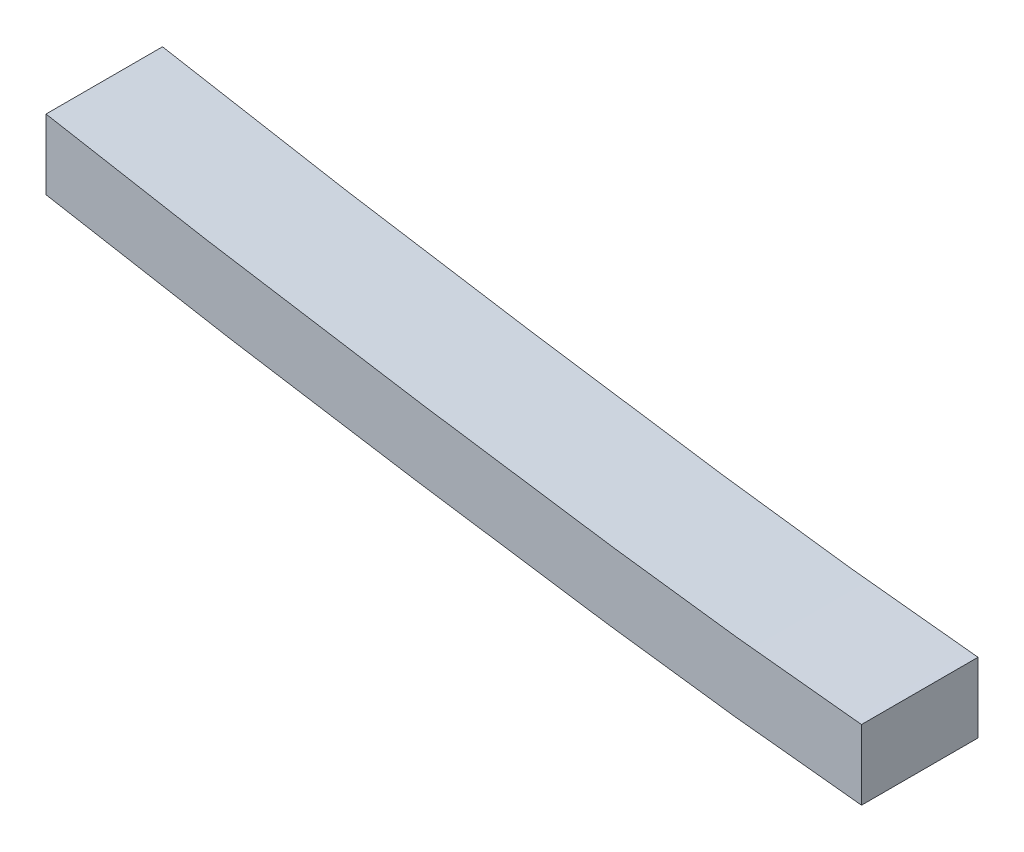
ISO-10303-21;
HEADER;
FILE_DESCRIPTION(('STEP AP214'),'2;1');
FILE_NAME('part.step','',(''),(''),'','','');
FILE_SCHEMA(('AUTOMOTIVE_DESIGN { 1 0 10303 214 1 1 1 1 }'));
ENDSEC;
DATA;
#1=APPLICATION_CONTEXT('core data for automotive mechanical design processes');
#2=APPLICATION_PROTOCOL_DEFINITION('international standard','automotive_design',2000,#1);
#3=PRODUCT_CONTEXT('',#1,'mechanical');
#4=PRODUCT('Part','Part','',(#3));
#5=PRODUCT_RELATED_PRODUCT_CATEGORY('part','',(#4));
#6=PRODUCT_DEFINITION_FORMATION('','',#4);
#7=PRODUCT_DEFINITION_CONTEXT('part definition',#1,'design');
#8=PRODUCT_DEFINITION('design','',#6,#7);
#9=PRODUCT_DEFINITION_SHAPE('','',#8);
#10=(LENGTH_UNIT() NAMED_UNIT(*) SI_UNIT(.MILLI.,.METRE.));
#11=(NAMED_UNIT(*) PLANE_ANGLE_UNIT() SI_UNIT($,.RADIAN.));
#12=(NAMED_UNIT(*) SI_UNIT($,.STERADIAN.) SOLID_ANGLE_UNIT());
#13=UNCERTAINTY_MEASURE_WITH_UNIT(LENGTH_MEASURE(1.E-05),#10,'distance_accuracy_value','');
#14=(GEOMETRIC_REPRESENTATION_CONTEXT(3) GLOBAL_UNCERTAINTY_ASSIGNED_CONTEXT((#13)) GLOBAL_UNIT_ASSIGNED_CONTEXT((#10,
#11,#12)) REPRESENTATION_CONTEXT('',''));
#15=CARTESIAN_POINT('',(0.,0.,0.));
#16=DIRECTION('',(0.,0.,1.));
#17=DIRECTION('',(1.,0.,0.));
#18=AXIS2_PLACEMENT_3D('',#15,#16,#17);
#19=CARTESIAN_POINT('',(-12.2190252308509,6.60300425842576,5.55));
#20=DIRECTION('',(0.,0.,1.));
#21=DIRECTION('',(1.,0.,0.));
#22=AXIS2_PLACEMENT_3D('',#19,#20,#21);
#23=PLANE('',#22);
#24=CARTESIAN_POINT('',(-8.71902523085093,6.08389376730887,5.55));
#25=CARTESIAN_POINT('',(-8.90481932831119,6.10063782187626,5.55));
#26=CARTESIAN_POINT('',(-9.08974031602656,6.12058943976316,5.55));
#27=CARTESIAN_POINT('',(-9.27376246282761,6.14272153894149,5.55));
#28=CARTESIAN_POINT('',(-9.40082328253992,6.15800297496665,5.55));
#29=CARTESIAN_POINT('',(-9.52745530195692,6.17432138143792,5.55));
#30=CARTESIAN_POINT('',(-9.65364799660021,6.19135877188536,5.55));
#31=CARTESIAN_POINT('',(-9.76704585129001,6.20666871935667,5.55));
#32=CARTESIAN_POINT('',(-9.88008886900471,6.22255849886021,5.55));
#33=CARTESIAN_POINT('',(-9.99276940780868,6.23883276318505,5.55));
#34=CARTESIAN_POINT('',(-10.0974990561943,6.25395869352375,5.55));
#35=CARTESIAN_POINT('',(-10.2019154980729,6.26941625717988,5.55));
#36=CARTESIAN_POINT('',(-10.3060135956174,6.28508908807513,5.55));
#37=CARTESIAN_POINT('',(-10.4059757492127,6.3001392183482,5.55));
#38=CARTESIAN_POINT('',(-10.5056442831997,6.31538734302663,5.55));
#39=CARTESIAN_POINT('',(-10.6050166861198,6.33077664184098,5.55));
#40=CARTESIAN_POINT('',(-10.7067309464635,6.34652861220814,5.55));
#41=CARTESIAN_POINT('',(-10.8081349646909,6.36242847683451,5.55));
#42=CARTESIAN_POINT('',(-10.9092289462605,6.37847177829881,5.55));
#43=CARTESIAN_POINT('',(-11.0198436378866,6.39602598693303,5.55));
#44=CARTESIAN_POINT('',(-11.130087207191,6.41375193667909,5.55));
#45=CARTESIAN_POINT('',(-11.239962684928,6.43171006483608,5.55));
#46=CARTESIAN_POINT('',(-11.3578105532593,6.45097120632197,5.55));
#47=CARTESIAN_POINT('',(-11.475235071375,6.47050018969724,5.55));
#48=CARTESIAN_POINT('',(-11.5922416684129,6.49043854821762,5.55));
#49=CARTESIAN_POINT('',(-11.727918541864,6.51355839115191,5.55));
#50=CARTESIAN_POINT('',(-11.8630336677974,6.53722987262494,5.55));
#51=CARTESIAN_POINT('',(-11.9975954228639,6.56174650106607,5.55));
#52=CARTESIAN_POINT('',(-12.071572258484,6.57522479280843,5.55));
#53=CARTESIAN_POINT('',(-12.1453818205482,6.58895961856022,5.55));
#54=CARTESIAN_POINT('',(-12.2190252308509,6.60300425842576,5.55));
#55=(BOUNDED_CURVE() B_SPLINE_CURVE(3,(#24,#25,#26,#27,#28,#29,#30,#31,#32,#33,#34,#35,#36,#37,
#38,#39,#40,#41,#42,#43,#44,#45,#46,#47,#48,#49,#50,#51,#52,#53,#54),.UNSPECIFIED.,.F.,
.F.) B_SPLINE_CURVE_WITH_KNOTS((4,3,3,3,3,3,3,3,3,3,4),(-0.19498564125759,-0.170688809271797,
-0.153912701383735,-0.138837544696349,-0.124826111346929,-0.111371369275719,-0.0975995463382309,
-0.082530736863067,-0.0663685584451572,-0.0476274456240645,-0.0373243084375754),
.UNSPECIFIED.) CURVE() GEOMETRIC_REPRESENTATION_ITEM() RATIONAL_B_SPLINE_CURVE((1.,1.,1.,1.,1.,
1.,1.,1.,1.,1.,1.,1.,1.,1.,1.,1.,1.,1.,1.,1.,1.,1.,1.,1.,1.,1.,1.,1.,1.,1.,1.)) REPRESENTATION_ITEM(''));
#56=CARTESIAN_POINT('',(-8.71902523085093,6.08389376730887,5.55));
#57=VERTEX_POINT('',#56);
#58=CARTESIAN_POINT('',(-12.2190252308509,6.60300425842576,5.55));
#59=VERTEX_POINT('',#58);
#60=EDGE_CURVE('E45',#57,#59,#55,.T.);
#61=ORIENTED_EDGE('',*,*,#60,.F.);
#62=DIRECTION('',(0.,1.,0.));
#63=VECTOR('',#62,1.);
#64=CARTESIAN_POINT('',(-8.71902523085093,6.08389376730887,5.55));
#65=LINE('',#64,#63);
#66=CARTESIAN_POINT('',(-8.71902523085093,6.38389376730887,5.55));
#67=VERTEX_POINT('',#66);
#68=EDGE_CURVE('E11',#57,#67,#65,.T.);
#69=ORIENTED_EDGE('',*,*,#68,.T.);
#70=CARTESIAN_POINT('',(-12.2190252308509,6.90300425842576,5.55));
#71=CARTESIAN_POINT('',(-12.0781613608036,6.87613990876096,5.55));
#72=CARTESIAN_POINT('',(-11.9366897589315,6.85040721379511,5.55));
#73=CARTESIAN_POINT('',(-11.7946018828376,6.82544044851815,5.55));
#74=CARTESIAN_POINT('',(-11.6702749912554,6.80359452890081,5.55));
#75=CARTESIAN_POINT('',(-11.5454761218485,6.78233315353963,5.55));
#76=CARTESIAN_POINT('',(-11.4201984231378,6.76145129679141,5.55));
#77=CARTESIAN_POINT('',(-11.310580436766,6.74317967213671,5.55));
#78=CARTESIAN_POINT('',(-11.2005957607161,6.72519821845924,5.55));
#79=CARTESIAN_POINT('',(-11.090240444414,6.70741508859998,5.55));
#80=CARTESIAN_POINT('',(-10.9896685970085,6.69120850895772,5.55));
#81=CARTESIAN_POINT('',(-10.8887888595256,6.6751665351971,5.55));
#82=CARTESIAN_POINT('',(-10.787599678124,6.65926336861859,5.55));
#83=CARTESIAN_POINT('',(-10.6884567770395,6.64368180101243,5.55));
#84=CARTESIAN_POINT('',(-10.5890167617251,6.62823300665637,5.55));
#85=CARTESIAN_POINT('',(-10.4892804607235,6.61294154485733,5.55));
#86=CARTESIAN_POINT('',(-10.385435307837,6.59702011833127,5.55));
#87=CARTESIAN_POINT('',(-10.2812689881523,6.58126940243937,5.55));
#88=CARTESIAN_POINT('',(-10.1767854383519,6.56577642157641,5.55));
#89=CARTESIAN_POINT('',(-10.064867756061,6.54918109615655,5.55));
#90=CARTESIAN_POINT('',(-9.95258619282989,6.53288203715611,5.55));
#91=CARTESIAN_POINT('',(-9.83994781387073,6.51704658656788,5.55));
#92=CARTESIAN_POINT('',(-9.7093978337298,6.498693004255,5.55));
#93=CARTESIAN_POINT('',(-9.57836864581011,6.48096259325002,5.55));
#94=CARTESIAN_POINT('',(-9.44687224716815,6.46418757602226,5.55));
#95=CARTESIAN_POINT('',(-9.24863448248732,6.43889835173888,5.55));
#96=CARTESIAN_POINT('',(-9.04933572094374,6.41578341672397,5.55));
#97=CARTESIAN_POINT('',(-8.84901155944429,6.3961324555279,5.55));
#98=CARTESIAN_POINT('',(-8.8057306012979,6.39188677481372,5.55));
#99=CARTESIAN_POINT('',(-8.76240173312139,6.3878029255162,5.55));
#100=CARTESIAN_POINT('',(-8.71902523085093,6.38389376730887,5.55));
#101=(BOUNDED_CURVE() B_SPLINE_CURVE(3,(#70,#71,#72,#73,#74,#75,#76,#77,#78,#79,#80,#81,#82,#83,
#84,#85,#86,#87,#88,#89,#90,#91,#92,#93,#94,#95,#96,#97,#98,#99,#100),.UNSPECIFIED.,.F.,
.F.) B_SPLINE_CURVE_WITH_KNOTS((4,3,3,3,3,3,3,3,3,3,4),(0.0373243084375755,0.0570319750400773,
0.0742761833172664,0.0893648655598069,0.103115871844744,0.116588800838088,0.130616776179978,
0.145642859142282,0.163058369294786,0.189313170483743,0.19498564125759),
.UNSPECIFIED.) CURVE() GEOMETRIC_REPRESENTATION_ITEM() RATIONAL_B_SPLINE_CURVE((1.,1.,1.,1.,1.,
1.,1.,1.,1.,1.,1.,1.,1.,1.,1.,1.,1.,1.,1.,1.,1.,1.,1.,1.,1.,1.,1.,1.,1.,1.,1.)) REPRESENTATION_ITEM(''));
#102=CARTESIAN_POINT('',(-12.2190252308509,6.90300425842576,5.55));
#103=VERTEX_POINT('',#102);
#104=EDGE_CURVE('E23',#103,#67,#101,.T.);
#105=ORIENTED_EDGE('',*,*,#104,.F.);
#106=DIRECTION('',(0.,1.,0.));
#107=VECTOR('',#106,1.);
#108=CARTESIAN_POINT('',(-12.2190252308509,6.60300425842576,5.55));
#109=LINE('',#108,#107);
#110=EDGE_CURVE('E32',#59,#103,#109,.T.);
#111=ORIENTED_EDGE('',*,*,#110,.F.);
#112=EDGE_LOOP('',(#61,#69,#105,#111));
#113=FACE_BOUND('',#112,.T.);
#114=ADVANCED_FACE('F17',(#113),#23,.T.);
#115=CARTESIAN_POINT('',(-12.2190252308509,6.60300425842576,5.05));
#116=DIRECTION('',(-1.,0.,0.));
#117=DIRECTION('',(0.,0.,1.));
#118=AXIS2_PLACEMENT_3D('',#115,#116,#117);
#119=PLANE('',#118);
#120=CARTESIAN_POINT('',(-12.2190252308509,6.60300425842576,5.55));
#121=CARTESIAN_POINT('',(-12.2190252308509,6.60300425842576,5.38333333333333));
#122=CARTESIAN_POINT('',(-12.2190252308509,6.60300425842576,5.21666666666667));
#123=CARTESIAN_POINT('',(-12.2190252308509,6.60300425842576,5.05));
#124=(BOUNDED_CURVE() B_SPLINE_CURVE(3,(#120,#121,#122,#123),.UNSPECIFIED.,.F.,
.F.) B_SPLINE_CURVE_WITH_KNOTS((4,4),(-0.1,-0.05),
.UNSPECIFIED.) CURVE() GEOMETRIC_REPRESENTATION_ITEM() RATIONAL_B_SPLINE_CURVE((1.,1.,1.,1.)) REPRESENTATION_ITEM(''));
#125=CARTESIAN_POINT('',(-12.2190252308509,6.60300425842576,5.05));
#126=VERTEX_POINT('',#125);
#127=EDGE_CURVE('E81',#59,#126,#124,.T.);
#128=ORIENTED_EDGE('',*,*,#127,.F.);
#129=ORIENTED_EDGE('',*,*,#110,.T.);
#130=CARTESIAN_POINT('',(-12.2190252308509,6.90300425842576,5.05));
#131=CARTESIAN_POINT('',(-12.2190252308509,6.90300425842576,5.21666666666667));
#132=CARTESIAN_POINT('',(-12.2190252308509,6.90300425842576,5.38333333333333));
#133=CARTESIAN_POINT('',(-12.2190252308509,6.90300425842576,5.55));
#134=(BOUNDED_CURVE() B_SPLINE_CURVE(3,(#130,#131,#132,#133),.UNSPECIFIED.,.F.,
.F.) B_SPLINE_CURVE_WITH_KNOTS((4,4),(0.05,0.1),
.UNSPECIFIED.) CURVE() GEOMETRIC_REPRESENTATION_ITEM() RATIONAL_B_SPLINE_CURVE((1.,1.,1.,1.)) REPRESENTATION_ITEM(''));
#135=CARTESIAN_POINT('',(-12.2190252308509,6.90300425842576,5.05));
#136=VERTEX_POINT('',#135);
#137=EDGE_CURVE('E75',#136,#103,#134,.T.);
#138=ORIENTED_EDGE('',*,*,#137,.F.);
#139=DIRECTION('',(0.,1.,0.));
#140=VECTOR('',#139,1.);
#141=CARTESIAN_POINT('',(-12.2190252308509,6.60300425842576,5.05));
#142=LINE('',#141,#140);
#143=EDGE_CURVE('E83',#126,#136,#142,.T.);
#144=ORIENTED_EDGE('',*,*,#143,.F.);
#145=EDGE_LOOP('',(#128,#129,#138,#144));
#146=FACE_BOUND('',#145,.T.);
#147=ADVANCED_FACE('F78',(#146),#119,.T.);
#148=CARTESIAN_POINT('',(-8.71902523085093,6.08389376730887,5.05));
#149=DIRECTION('',(0.,0.,-1.));
#150=DIRECTION('',(0.,-1.,0.));
#151=AXIS2_PLACEMENT_3D('',#148,#149,#150);
#152=PLANE('',#151);
#153=CARTESIAN_POINT('',(-12.2190252308509,6.60300425842576,5.05));
#154=CARTESIAN_POINT('',(-12.0781613608036,6.57613990876096,5.05));
#155=CARTESIAN_POINT('',(-11.9366897589315,6.55040721379511,5.05));
#156=CARTESIAN_POINT('',(-11.7946018828376,6.52544044851815,5.05));
#157=CARTESIAN_POINT('',(-11.6702749912554,6.50359452890081,5.05));
#158=CARTESIAN_POINT('',(-11.5454761218485,6.48233315353963,5.05));
#159=CARTESIAN_POINT('',(-11.4201984231378,6.46145129679141,5.05));
#160=CARTESIAN_POINT('',(-11.310580436766,6.44317967213671,5.05));
#161=CARTESIAN_POINT('',(-11.2005957607161,6.42519821845924,5.05));
#162=CARTESIAN_POINT('',(-11.090240444414,6.40741508859998,5.05));
#163=CARTESIAN_POINT('',(-10.9896685970084,6.3912085089577,5.05));
#164=CARTESIAN_POINT('',(-10.8887888595253,6.37516653519706,5.05));
#165=CARTESIAN_POINT('',(-10.7875996781236,6.35926336861853,5.05));
#166=CARTESIAN_POINT('',(-10.6884567770394,6.3436818010124,5.05));
#167=CARTESIAN_POINT('',(-10.5890167617252,6.32823300665637,5.05));
#168=CARTESIAN_POINT('',(-10.4892804607237,6.31294154485737,5.05));
#169=CARTESIAN_POINT('',(-10.3854353078368,6.29702011833124,5.05));
#170=CARTESIAN_POINT('',(-10.2812689881516,6.28126940243927,5.05));
#171=CARTESIAN_POINT('',(-10.1767854383507,6.26577642157623,5.05));
#172=CARTESIAN_POINT('',(-10.0648677560622,6.24918109615672,5.05));
#173=CARTESIAN_POINT('',(-9.95258619283337,6.23288203715662,5.05));
#174=CARTESIAN_POINT('',(-9.83994781387657,6.2170465865687,5.05));
#175=CARTESIAN_POINT('',(-9.70939783373849,6.1986930042562,5.05));
#176=CARTESIAN_POINT('',(-9.57836864582166,6.18096259325157,5.05));
#177=CARTESIAN_POINT('',(-9.44687224718258,6.1641875760241,5.05));
#178=CARTESIAN_POINT('',(-9.24863448242184,6.13889835173041,5.05));
#179=CARTESIAN_POINT('',(-9.0493357207975,6.11578341670692,5.05));
#180=CARTESIAN_POINT('',(-8.84901155921646,6.09613245550555,5.05));
#181=CARTESIAN_POINT('',(-8.80573060114584,6.09188677479938,5.05));
#182=CARTESIAN_POINT('',(-8.76240173304527,6.08780292550934,5.05));
#183=CARTESIAN_POINT('',(-8.71902523085093,6.08389376730887,5.05));
#184=(BOUNDED_CURVE() B_SPLINE_CURVE(3,(#153,#154,#155,#156,#157,#158,#159,#160,#161,#162,#163,
#164,#165,#166,#167,#168,#169,#170,#171,#172,#173,#174,#175,#176,#177,#178,#179,#180,#181,#182,
#183),.UNSPECIFIED.,.F.,.F.) B_SPLINE_CURVE_WITH_KNOTS((4,3,3,3,3,3,3,3,3,3,4),
(-0.330972127183007,-0.295347986356005,-0.264176863132379,-0.236902130311707,-0.212045418744135,
-0.187691367628359,-0.162333998885575,-0.135172422311705,-0.103691648928077,-0.0562327206753098,
-0.0459790005669973),
.UNSPECIFIED.) CURVE() GEOMETRIC_REPRESENTATION_ITEM() RATIONAL_B_SPLINE_CURVE((1.,1.,1.,1.,1.,
1.,1.,1.,1.,1.,1.,1.,1.,1.,1.,1.,1.,1.,1.,1.,1.,1.,1.,1.,1.,1.,1.,1.,1.,1.,1.)) REPRESENTATION_ITEM(''));
#185=CARTESIAN_POINT('',(-8.71902523085093,6.08389376730887,5.05));
#186=VERTEX_POINT('',#185);
#187=EDGE_CURVE('E101',#126,#186,#184,.T.);
#188=ORIENTED_EDGE('',*,*,#187,.F.);
#189=ORIENTED_EDGE('',*,*,#143,.T.);
#190=CARTESIAN_POINT('',(-8.71902523085093,6.38389376730887,5.05));
#191=CARTESIAN_POINT('',(-8.904819328315,6.40063782187661,5.05));
#192=CARTESIAN_POINT('',(-9.08974031603414,6.42058943976398,5.05));
#193=CARTESIAN_POINT('',(-9.27376246283892,6.44272153894285,5.05));
#194=CARTESIAN_POINT('',(-9.40082328255255,6.45800297496824,5.05));
#195=CARTESIAN_POINT('',(-9.52745530197086,6.47432138143974,5.05));
#196=CARTESIAN_POINT('',(-9.65364799661544,6.49135877188742,5.05));
#197=CARTESIAN_POINT('',(-9.76704585130534,6.5066687193588,5.05));
#198=CARTESIAN_POINT('',(-9.88008886902013,6.5225584988624,5.05));
#199=CARTESIAN_POINT('',(-9.99276940782419,6.53883276318729,5.05));
#200=CARTESIAN_POINT('',(-10.097499056209,6.5539586935259,5.05));
#201=CARTESIAN_POINT('',(-10.2019154980867,6.56941625718193,5.05));
#202=CARTESIAN_POINT('',(-10.3060135956302,6.58508908807706,5.05));
#203=CARTESIAN_POINT('',(-10.4059757492257,6.60013921835019,5.05));
#204=CARTESIAN_POINT('',(-10.505644283213,6.61538734302867,5.05));
#205=CARTESIAN_POINT('',(-10.6050166861333,6.63077664184308,5.05));
#206=CARTESIAN_POINT('',(-10.7067309464772,6.64652861221028,5.05));
#207=CARTESIAN_POINT('',(-10.8081349647048,6.6624284768367,5.05));
#208=CARTESIAN_POINT('',(-10.9092289462746,6.67847177830105,5.05));
#209=CARTESIAN_POINT('',(-11.0198436378994,6.69602598693509,5.05));
#210=CARTESIAN_POINT('',(-11.1300872072027,6.71375193668098,5.05));
#211=CARTESIAN_POINT('',(-11.2399626849385,6.7317100648378,5.05));
#212=CARTESIAN_POINT('',(-11.3578105532717,6.75097120632402,5.05));
#213=CARTESIAN_POINT('',(-11.4752350713893,6.77050018969963,5.05));
#214=CARTESIAN_POINT('',(-11.5922416684291,6.79043854822038,5.05));
#215=CARTESIAN_POINT('',(-11.7279185418808,6.81355839115482,5.05));
#216=CARTESIAN_POINT('',(-11.8630336678148,6.83722987262802,5.05));
#217=CARTESIAN_POINT('',(-11.9975954228819,6.86174650106935,5.05));
#218=CARTESIAN_POINT('',(-12.071572258496,6.87522479281066,5.05));
#219=CARTESIAN_POINT('',(-12.1453818205542,6.88895961856136,5.05));
#220=CARTESIAN_POINT('',(-12.2190252308509,6.90300425842576,5.05));
#221=(BOUNDED_CURVE() B_SPLINE_CURVE(3,(#190,#191,#192,#193,#194,#195,#196,#197,#198,#199,#200,
#201,#202,#203,#204,#205,#206,#207,#208,#209,#210,#211,#212,#213,#214,#215,#216,#217,#218,#219,
#220),.UNSPECIFIED.,.F.,.F.) B_SPLINE_CURVE_WITH_KNOTS((4,3,3,3,3,3,3,3,3,3,4),
(0.0459790005669973,0.0898986477676318,0.120223619363394,0.147473903004429,0.172801369969007,
0.197122545885193,0.222016886228271,0.249255696466955,0.278470911624244,0.312347882239923,
0.330972127183007),
.UNSPECIFIED.) CURVE() GEOMETRIC_REPRESENTATION_ITEM() RATIONAL_B_SPLINE_CURVE((1.,1.,1.,1.,1.,
1.,1.,1.,1.,1.,1.,1.,1.,1.,1.,1.,1.,1.,1.,1.,1.,1.,1.,1.,1.,1.,1.,1.,1.,1.,1.)) REPRESENTATION_ITEM(''));
#222=CARTESIAN_POINT('',(-8.71902523085093,6.38389376730887,5.05));
#223=VERTEX_POINT('',#222);
#224=EDGE_CURVE('E88',#223,#136,#221,.T.);
#225=ORIENTED_EDGE('',*,*,#224,.F.);
#226=DIRECTION('',(0.,1.,0.));
#227=VECTOR('',#226,1.);
#228=CARTESIAN_POINT('',(-8.71902523085093,6.08389376730887,5.05));
#229=LINE('',#228,#227);
#230=EDGE_CURVE('E118',#186,#223,#229,.T.);
#231=ORIENTED_EDGE('',*,*,#230,.F.);
#232=EDGE_LOOP('',(#188,#189,#225,#231));
#233=FACE_BOUND('',#232,.T.);
#234=ADVANCED_FACE('F154',(#233),#152,.T.);
#235=CARTESIAN_POINT('',(-8.71902523085093,6.08389376730887,5.55));
#236=DIRECTION('',(1.,0.,0.));
#237=DIRECTION('',(0.,1.,0.));
#238=AXIS2_PLACEMENT_3D('',#235,#236,#237);
#239=PLANE('',#238);
#240=CARTESIAN_POINT('',(-8.71902523085093,6.08389376730887,5.05));
#241=CARTESIAN_POINT('',(-8.71902523085093,6.08389376730887,5.21666666666667));
#242=CARTESIAN_POINT('',(-8.71902523085093,6.08389376730887,5.38333333333333));
#243=CARTESIAN_POINT('',(-8.71902523085093,6.08389376730887,5.55));
#244=(BOUNDED_CURVE() B_SPLINE_CURVE(3,(#240,#241,#242,#243),.UNSPECIFIED.,.F.,
.F.) B_SPLINE_CURVE_WITH_KNOTS((4,4),(-0.1,-0.05),
.UNSPECIFIED.) CURVE() GEOMETRIC_REPRESENTATION_ITEM() RATIONAL_B_SPLINE_CURVE((1.,1.,1.,1.)) REPRESENTATION_ITEM(''));
#245=EDGE_CURVE('E76',#186,#57,#244,.T.);
#246=ORIENTED_EDGE('',*,*,#245,.F.);
#247=ORIENTED_EDGE('',*,*,#230,.T.);
#248=CARTESIAN_POINT('',(-8.71902523085093,6.38389376730887,5.55));
#249=CARTESIAN_POINT('',(-8.71902523085093,6.38389376730887,5.38333333333333));
#250=CARTESIAN_POINT('',(-8.71902523085093,6.38389376730887,5.21666666666667));
#251=CARTESIAN_POINT('',(-8.71902523085093,6.38389376730887,5.05));
#252=(BOUNDED_CURVE() B_SPLINE_CURVE(3,(#248,#249,#250,#251),.UNSPECIFIED.,.F.,
.F.) B_SPLINE_CURVE_WITH_KNOTS((4,4),(0.05,0.1),
.UNSPECIFIED.) CURVE() GEOMETRIC_REPRESENTATION_ITEM() RATIONAL_B_SPLINE_CURVE((1.,1.,1.,1.)) REPRESENTATION_ITEM(''));
#253=EDGE_CURVE('E95',#67,#223,#252,.T.);
#254=ORIENTED_EDGE('',*,*,#253,.F.);
#255=ORIENTED_EDGE('',*,*,#68,.F.);
#256=EDGE_LOOP('',(#246,#247,#254,#255));
#257=FACE_BOUND('',#256,.T.);
#258=ADVANCED_FACE('F155',(#257),#239,.T.);
#259=CARTESIAN_POINT('',(-7.39999983459711,6.32999986588955,0.));
#260=CARTESIAN_POINT('',(-7.39999983459711,6.32999986588955,10.6));
#261=CARTESIAN_POINT('',(-7.52979960420859,6.32823454604201,0.));
#262=CARTESIAN_POINT('',(-7.52979960420859,6.32823454604201,10.6));
#263=CARTESIAN_POINT('',(-7.78873217756179,6.32833956220266,0.));
#264=CARTESIAN_POINT('',(-7.78873217756179,6.32833956220266,10.6));
#265=CARTESIAN_POINT('',(-8.17513022849766,6.33940336335837,0.));
#266=CARTESIAN_POINT('',(-8.17513022849766,6.33940336335837,10.6));
#267=CARTESIAN_POINT('',(-8.68632478818272,6.37442296446255,0.));
#268=CARTESIAN_POINT('',(-8.68632478818272,6.37442296446255,10.6));
#269=CARTESIAN_POINT('',(-9.31853845284807,6.4438782927068,0.));
#270=CARTESIAN_POINT('',(-9.31853845284807,6.4438782927068,10.6));
#271=CARTESIAN_POINT('',(-9.94373460373111,6.52953067809868,0.));
#272=CARTESIAN_POINT('',(-9.94373460373111,6.52953067809868,10.6));
#273=CARTESIAN_POINT('',(-10.5616060518421,6.62301531446441,0.));
#274=CARTESIAN_POINT('',(-10.5616060518421,6.62301531446441,10.6));
#275=CARTESIAN_POINT('',(-11.1719090886667,6.71933867077066,0.));
#276=CARTESIAN_POINT('',(-11.1719090886667,6.71933867077066,10.6));
#277=CARTESIAN_POINT('',(-11.774723771425,6.81946120729226,0.));
#278=CARTESIAN_POINT('',(-11.774723771425,6.81946120729226,10.6));
#279=CARTESIAN_POINT('',(-12.3702379944649,6.9282193677502,0.));
#280=CARTESIAN_POINT('',(-12.3702379944649,6.9282193677502,10.6));
#281=CARTESIAN_POINT('',(-12.8409224242921,7.02729895171738,0.));
#282=CARTESIAN_POINT('',(-12.8409224242921,7.02729895171738,10.6));
#283=CARTESIAN_POINT('',(-13.1907343276667,7.11105574581804,0.));
#284=CARTESIAN_POINT('',(-13.1907343276667,7.11105574581804,10.6));
#285=CARTESIAN_POINT('',(-13.4225162106822,7.17147963320149,0.));
#286=CARTESIAN_POINT('',(-13.4225162106822,7.17147963320149,10.6));
#287=CARTESIAN_POINT('',(-13.5380506271048,7.2028381916372,0.));
#288=CARTESIAN_POINT('',(-13.5380506271048,7.2028381916372,10.6));
#289=(BOUNDED_SURFACE() B_SPLINE_SURFACE(5,1,((#259,#260),(#261,#262),(#263,#264),(#265,#266),
(#267,#268),(#269,#270),(#271,#272),(#273,#274),(#275,#276),(#277,#278),(#279,#280),(#281,#282),
(#283,#284),(#285,#286),(#287,#288)),.UNSPECIFIED.,.F.,.F.,.F.) B_SPLINE_SURFACE_WITH_KNOTS((6,
1,1,1,1,1,1,1,1,1,6),(2,2),(0.,0.1,0.2,0.3,0.4,0.5,0.6,0.7,0.8,0.9,1.),(0.,1.06),
.UNSPECIFIED.) GEOMETRIC_REPRESENTATION_ITEM() RATIONAL_B_SPLINE_SURFACE(((1.,1.),(1.,1.),(1.,
1.),(1.,1.),(1.,1.),(1.,1.),(1.,1.),(1.,1.),(1.,1.),(1.,1.),(1.,1.),(1.,1.),(1.,1.),(1.,1.),(1.,1.))) REPRESENTATION_ITEM('') SURFACE());
#290=ORIENTED_EDGE('',*,*,#253,.T.);
#291=ORIENTED_EDGE('',*,*,#224,.T.);
#292=ORIENTED_EDGE('',*,*,#137,.T.);
#293=ORIENTED_EDGE('',*,*,#104,.T.);
#294=EDGE_LOOP('',(#290,#291,#292,#293));
#295=FACE_BOUND('',#294,.T.);
#296=ADVANCED_FACE('F86',(#295),#289,.T.);
#297=CARTESIAN_POINT('',(-7.39999983459711,6.02999986588955,0.));
#298=CARTESIAN_POINT('',(-7.39999983459711,6.02999986588955,10.6));
#299=CARTESIAN_POINT('',(-7.52979960420859,6.02823454604201,0.));
#300=CARTESIAN_POINT('',(-7.52979960420859,6.02823454604201,10.6));
#301=CARTESIAN_POINT('',(-7.78873217756179,6.02833956220266,0.));
#302=CARTESIAN_POINT('',(-7.78873217756179,6.02833956220266,10.6));
#303=CARTESIAN_POINT('',(-8.17513022849766,6.03940336335837,0.));
#304=CARTESIAN_POINT('',(-8.17513022849766,6.03940336335837,10.6));
#305=CARTESIAN_POINT('',(-8.68632478818272,6.07442296446255,0.));
#306=CARTESIAN_POINT('',(-8.68632478818272,6.07442296446255,10.6));
#307=CARTESIAN_POINT('',(-9.31853845284807,6.1438782927068,0.));
#308=CARTESIAN_POINT('',(-9.31853845284807,6.1438782927068,10.6));
#309=CARTESIAN_POINT('',(-9.94373460373111,6.22953067809868,0.));
#310=CARTESIAN_POINT('',(-9.94373460373111,6.22953067809868,10.6));
#311=CARTESIAN_POINT('',(-10.5616060518421,6.32301531446441,0.));
#312=CARTESIAN_POINT('',(-10.5616060518421,6.32301531446441,10.6));
#313=CARTESIAN_POINT('',(-11.1719090886667,6.41933867077066,0.));
#314=CARTESIAN_POINT('',(-11.1719090886667,6.41933867077066,10.6));
#315=CARTESIAN_POINT('',(-11.774723771425,6.51946120729226,0.));
#316=CARTESIAN_POINT('',(-11.774723771425,6.51946120729226,10.6));
#317=CARTESIAN_POINT('',(-12.3702379944649,6.6282193677502,0.));
#318=CARTESIAN_POINT('',(-12.3702379944649,6.6282193677502,10.6));
#319=CARTESIAN_POINT('',(-12.8409224242921,6.72729895171738,0.));
#320=CARTESIAN_POINT('',(-12.8409224242921,6.72729895171738,10.6));
#321=CARTESIAN_POINT('',(-13.1907343276667,6.81105574581804,0.));
#322=CARTESIAN_POINT('',(-13.1907343276667,6.81105574581804,10.6));
#323=CARTESIAN_POINT('',(-13.4225162106822,6.87147963320149,0.));
#324=CARTESIAN_POINT('',(-13.4225162106822,6.87147963320149,10.6));
#325=CARTESIAN_POINT('',(-13.5380506271048,6.9028381916372,0.));
#326=CARTESIAN_POINT('',(-13.5380506271048,6.9028381916372,10.6));
#327=(BOUNDED_SURFACE() B_SPLINE_SURFACE(5,1,((#297,#298),(#299,#300),(#301,#302),(#303,#304),
(#305,#306),(#307,#308),(#309,#310),(#311,#312),(#313,#314),(#315,#316),(#317,#318),(#319,#320),
(#321,#322),(#323,#324),(#325,#326)),.UNSPECIFIED.,.F.,.F.,.F.) B_SPLINE_SURFACE_WITH_KNOTS((6,
1,1,1,1,1,1,1,1,1,6),(2,2),(0.,0.1,0.2,0.3,0.4,0.5,0.6,0.7,0.8,0.9,1.),(0.,1.06),
.UNSPECIFIED.) GEOMETRIC_REPRESENTATION_ITEM() RATIONAL_B_SPLINE_SURFACE(((1.,1.),(1.,1.),(1.,
1.),(1.,1.),(1.,1.),(1.,1.),(1.,1.),(1.,1.),(1.,1.),(1.,1.),(1.,1.),(1.,1.),(1.,1.),(1.,1.),(1.,1.))) REPRESENTATION_ITEM('') SURFACE());
#328=ORIENTED_EDGE('',*,*,#245,.T.);
#329=ORIENTED_EDGE('',*,*,#60,.T.);
#330=ORIENTED_EDGE('',*,*,#127,.T.);
#331=ORIENTED_EDGE('',*,*,#187,.T.);
#332=EDGE_LOOP('',(#328,#329,#330,#331));
#333=FACE_BOUND('',#332,.T.);
#334=ADVANCED_FACE('F19',(#333),#327,.F.);
#335=CLOSED_SHELL('',(#114,#147,#234,#258,#296,#334));
#336=MANIFOLD_SOLID_BREP('B1',#335);
#337=ADVANCED_BREP_SHAPE_REPRESENTATION('',(#18,#336),#14);
#338=SHAPE_DEFINITION_REPRESENTATION(#9,#337);
ENDSEC;
END-ISO-10303-21;
